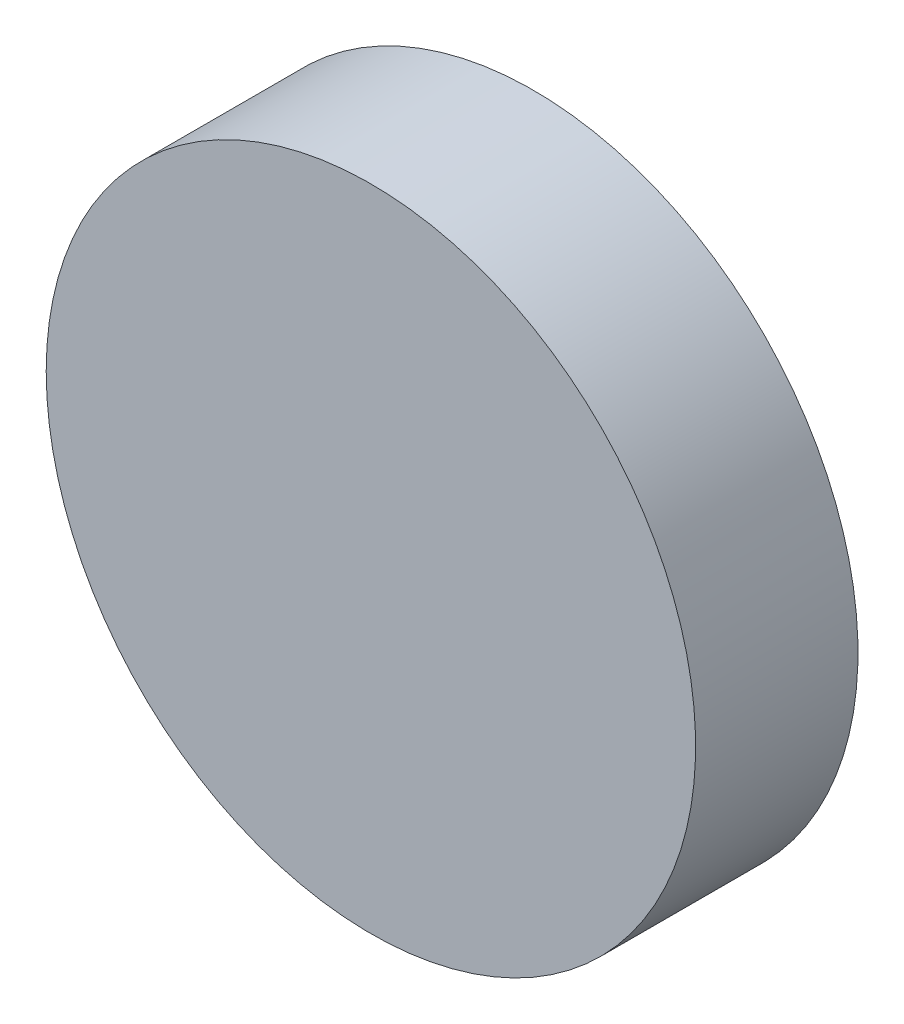
ISO-10303-21;
HEADER;
FILE_DESCRIPTION(('STEP AP214'),'2;1');
FILE_NAME('part.step','',(''),(''),'','','');
FILE_SCHEMA(('AUTOMOTIVE_DESIGN { 1 0 10303 214 1 1 1 1 }'));
ENDSEC;
DATA;
#1=APPLICATION_CONTEXT('core data for automotive mechanical design processes');
#2=APPLICATION_PROTOCOL_DEFINITION('international standard','automotive_design',2000,#1);
#3=PRODUCT_CONTEXT('',#1,'mechanical');
#4=PRODUCT('Part','Part','',(#3));
#5=PRODUCT_RELATED_PRODUCT_CATEGORY('part','',(#4));
#6=PRODUCT_DEFINITION_FORMATION('','',#4);
#7=PRODUCT_DEFINITION_CONTEXT('part definition',#1,'design');
#8=PRODUCT_DEFINITION('design','',#6,#7);
#9=PRODUCT_DEFINITION_SHAPE('','',#8);
#10=(LENGTH_UNIT() NAMED_UNIT(*) SI_UNIT(.MILLI.,.METRE.));
#11=(NAMED_UNIT(*) PLANE_ANGLE_UNIT() SI_UNIT($,.RADIAN.));
#12=(NAMED_UNIT(*) SI_UNIT($,.STERADIAN.) SOLID_ANGLE_UNIT());
#13=UNCERTAINTY_MEASURE_WITH_UNIT(LENGTH_MEASURE(1.E-05),#10,'distance_accuracy_value','');
#14=(GEOMETRIC_REPRESENTATION_CONTEXT(3) GLOBAL_UNCERTAINTY_ASSIGNED_CONTEXT((#13)) GLOBAL_UNIT_ASSIGNED_CONTEXT((#10,
#11,#12)) REPRESENTATION_CONTEXT('',''));
#15=CARTESIAN_POINT('',(0.,0.,0.));
#16=DIRECTION('',(0.,0.,1.));
#17=DIRECTION('',(1.,0.,0.));
#18=AXIS2_PLACEMENT_3D('',#15,#16,#17);
#19=CARTESIAN_POINT('',(0.0999998,0.,0.0499999));
#20=DIRECTION('',(0.,0.,-1.));
#21=DIRECTION('',(-1.,0.,0.));
#22=AXIS2_PLACEMENT_3D('',#19,#20,#21);
#23=PLANE('',#22);
#24=CARTESIAN_POINT('',(0.,0.,0.0499999));
#25=DIRECTION('',(0.,0.,-1.));
#26=DIRECTION('',(-1.,0.,0.));
#27=AXIS2_PLACEMENT_3D('',#24,#25,#26);
#28=CIRCLE('',#27,0.0999998);
#29=CARTESIAN_POINT('',(-0.0999998,0.,0.0499999));
#30=VERTEX_POINT('',#29);
#31=EDGE_CURVE('E17',#30,#30,#28,.T.);
#32=ORIENTED_EDGE('',*,*,#31,.F.);
#33=EDGE_LOOP('',(#32));
#34=FACE_BOUND('',#33,.T.);
#35=ADVANCED_FACE('F14',(#34),#23,.F.);
#36=CARTESIAN_POINT('',(0.,0.,0.));
#37=DIRECTION('',(0.,0.,-1.));
#38=DIRECTION('',(-1.,0.,0.));
#39=AXIS2_PLACEMENT_3D('',#36,#37,#38);
#40=CYLINDRICAL_SURFACE('',#39,0.0999998);
#41=ORIENTED_EDGE('',*,*,#31,.T.);
#42=EDGE_LOOP('',(#41));
#43=FACE_BOUND('',#42,.T.);
#44=CARTESIAN_POINT('',(0.,0.,0.));
#45=DIRECTION('',(0.,0.,-1.));
#46=DIRECTION('',(-1.,0.,0.));
#47=AXIS2_PLACEMENT_3D('',#44,#45,#46);
#48=CIRCLE('',#47,0.0999998);
#49=CARTESIAN_POINT('',(-0.0999998,0.,0.));
#50=VERTEX_POINT('',#49);
#51=EDGE_CURVE('E10',#50,#50,#48,.T.);
#52=ORIENTED_EDGE('',*,*,#51,.F.);
#53=EDGE_LOOP('',(#52));
#54=FACE_BOUND('',#53,.T.);
#55=ADVANCED_FACE('F26',(#43,#54),#40,.T.);
#56=CARTESIAN_POINT('',(0.0999998,0.,0.));
#57=DIRECTION('',(0.,0.,-1.));
#58=DIRECTION('',(-1.,0.,0.));
#59=AXIS2_PLACEMENT_3D('',#56,#57,#58);
#60=PLANE('',#59);
#61=ORIENTED_EDGE('',*,*,#51,.T.);
#62=EDGE_LOOP('',(#61));
#63=FACE_BOUND('',#62,.T.);
#64=ADVANCED_FACE('F34',(#63),#60,.T.);
#65=CLOSED_SHELL('',(#35,#55,#64));
#66=MANIFOLD_SOLID_BREP('B1',#65);
#67=ADVANCED_BREP_SHAPE_REPRESENTATION('',(#18,#66),#14);
#68=SHAPE_DEFINITION_REPRESENTATION(#9,#67);
ENDSEC;
END-ISO-10303-21;
